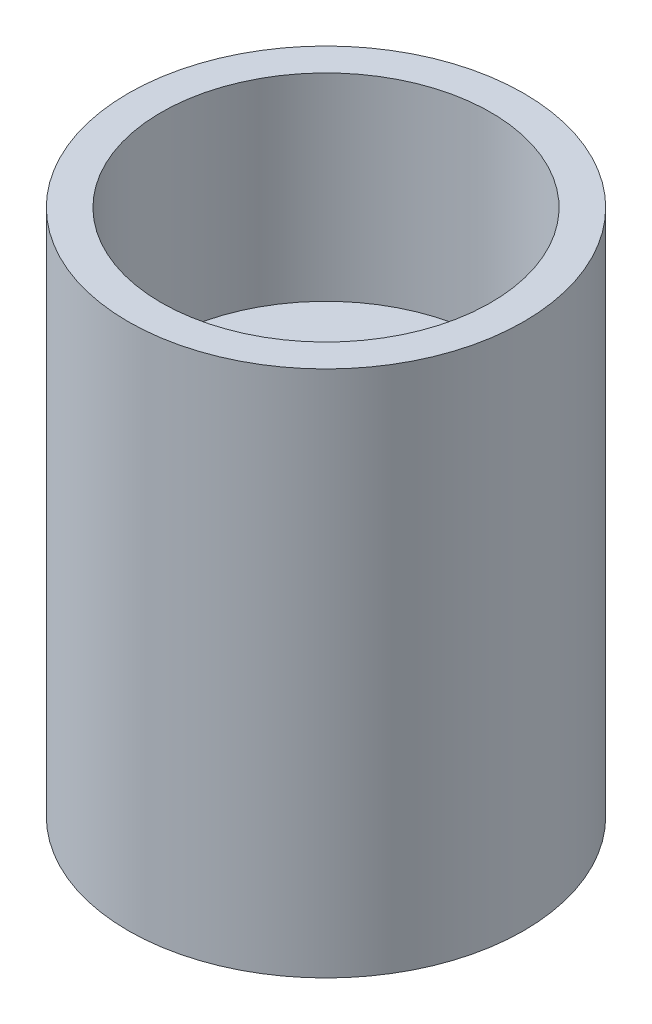
ISO-10303-21;
HEADER;
FILE_DESCRIPTION(('STEP AP214'),'2;1');
FILE_NAME('part.step','',(''),(''),'','','');
FILE_SCHEMA(('AUTOMOTIVE_DESIGN { 1 0 10303 214 1 1 1 1 }'));
ENDSEC;
DATA;
#1=APPLICATION_CONTEXT('core data for automotive mechanical design processes');
#2=APPLICATION_PROTOCOL_DEFINITION('international standard','automotive_design',2000,#1);
#3=PRODUCT_CONTEXT('',#1,'mechanical');
#4=PRODUCT('Part','Part','',(#3));
#5=PRODUCT_RELATED_PRODUCT_CATEGORY('part','',(#4));
#6=PRODUCT_DEFINITION_FORMATION('','',#4);
#7=PRODUCT_DEFINITION_CONTEXT('part definition',#1,'design');
#8=PRODUCT_DEFINITION('design','',#6,#7);
#9=PRODUCT_DEFINITION_SHAPE('','',#8);
#10=(LENGTH_UNIT() NAMED_UNIT(*) SI_UNIT(.MILLI.,.METRE.));
#11=(NAMED_UNIT(*) PLANE_ANGLE_UNIT() SI_UNIT($,.RADIAN.));
#12=(NAMED_UNIT(*) SI_UNIT($,.STERADIAN.) SOLID_ANGLE_UNIT());
#13=UNCERTAINTY_MEASURE_WITH_UNIT(LENGTH_MEASURE(1.E-05),#10,'distance_accuracy_value','');
#14=(GEOMETRIC_REPRESENTATION_CONTEXT(3) GLOBAL_UNCERTAINTY_ASSIGNED_CONTEXT((#13)) GLOBAL_UNIT_ASSIGNED_CONTEXT((#10,
#11,#12)) REPRESENTATION_CONTEXT('',''));
#15=CARTESIAN_POINT('',(0.,0.,0.));
#16=DIRECTION('',(0.,0.,1.));
#17=DIRECTION('',(1.,0.,0.));
#18=AXIS2_PLACEMENT_3D('',#15,#16,#17);
#19=CARTESIAN_POINT('',(0.,8.,0.));
#20=DIRECTION('',(0.,-1.,0.));
#21=DIRECTION('',(0.,0.,-1.));
#22=AXIS2_PLACEMENT_3D('',#19,#20,#21);
#23=CYLINDRICAL_SURFACE('',#22,3.);
#24=CARTESIAN_POINT('',(0.,8.,0.));
#25=DIRECTION('',(0.,1.,0.));
#26=DIRECTION('',(0.,0.,1.));
#27=AXIS2_PLACEMENT_3D('',#24,#25,#26);
#28=CIRCLE('',#27,3.);
#29=CARTESIAN_POINT('',(0.,8.,3.));
#30=VERTEX_POINT('',#29);
#31=EDGE_CURVE('E10',#30,#30,#28,.T.);
#32=ORIENTED_EDGE('',*,*,#31,.F.);
#33=EDGE_LOOP('',(#32));
#34=FACE_BOUND('',#33,.T.);
#35=CARTESIAN_POINT('',(0.,0.,0.));
#36=DIRECTION('',(0.,1.,0.));
#37=DIRECTION('',(0.,0.,1.));
#38=AXIS2_PLACEMENT_3D('',#35,#36,#37);
#39=CIRCLE('',#38,3.);
#40=CARTESIAN_POINT('',(0.,0.,3.));
#41=VERTEX_POINT('',#40);
#42=EDGE_CURVE('E42',#41,#41,#39,.T.);
#43=ORIENTED_EDGE('',*,*,#42,.T.);
#44=EDGE_LOOP('',(#43));
#45=FACE_BOUND('',#44,.T.);
#46=ADVANCED_FACE('F39',(#34,#45),#23,.T.);
#47=CARTESIAN_POINT('',(0.,8.,0.));
#48=DIRECTION('',(0.,1.,0.));
#49=DIRECTION('',(0.,0.,1.));
#50=AXIS2_PLACEMENT_3D('',#47,#48,#49);
#51=PLANE('',#50);
#52=CARTESIAN_POINT('',(0.,8.,0.));
#53=DIRECTION('',(0.,1.,0.));
#54=DIRECTION('',(0.,0.,1.));
#55=AXIS2_PLACEMENT_3D('',#52,#53,#54);
#56=CIRCLE('',#55,2.5);
#57=CARTESIAN_POINT('',(0.,8.,2.5));
#58=VERTEX_POINT('',#57);
#59=EDGE_CURVE('E53',#58,#58,#56,.T.);
#60=ORIENTED_EDGE('',*,*,#59,.F.);
#61=EDGE_LOOP('',(#60));
#62=FACE_BOUND('',#61,.T.);
#63=ORIENTED_EDGE('',*,*,#31,.T.);
#64=EDGE_LOOP('',(#63));
#65=FACE_BOUND('',#64,.T.);
#66=ADVANCED_FACE('F82',(#62,#65),#51,.T.);
#67=CARTESIAN_POINT('',(0.,0.,0.));
#68=DIRECTION('',(0.,1.,0.));
#69=DIRECTION('',(0.,0.,1.));
#70=AXIS2_PLACEMENT_3D('',#67,#68,#69);
#71=PLANE('',#70);
#72=CARTESIAN_POINT('',(0.,0.,0.));
#73=DIRECTION('',(0.,-1.,0.));
#74=DIRECTION('',(0.,0.,-1.));
#75=AXIS2_PLACEMENT_3D('',#72,#73,#74);
#76=CIRCLE('',#75,2.5);
#77=CARTESIAN_POINT('',(0.,0.,-2.5));
#78=VERTEX_POINT('',#77);
#79=EDGE_CURVE('E61',#78,#78,#76,.T.);
#80=ORIENTED_EDGE('',*,*,#79,.F.);
#81=EDGE_LOOP('',(#80));
#82=FACE_BOUND('',#81,.T.);
#83=ORIENTED_EDGE('',*,*,#42,.F.);
#84=EDGE_LOOP('',(#83));
#85=FACE_BOUND('',#84,.T.);
#86=ADVANCED_FACE('F78',(#82,#85),#71,.F.);
#87=CARTESIAN_POINT('',(0.,5.,0.));
#88=DIRECTION('',(0.,1.,0.));
#89=DIRECTION('',(0.,0.,1.));
#90=AXIS2_PLACEMENT_3D('',#87,#88,#89);
#91=CYLINDRICAL_SURFACE('',#90,2.5);
#92=CARTESIAN_POINT('',(0.,5.,0.));
#93=DIRECTION('',(0.,1.,0.));
#94=DIRECTION('',(0.,0.,1.));
#95=AXIS2_PLACEMENT_3D('',#92,#93,#94);
#96=CIRCLE('',#95,2.5);
#97=CARTESIAN_POINT('',(0.,5.,2.5));
#98=VERTEX_POINT('',#97);
#99=EDGE_CURVE('E51',#98,#98,#96,.T.);
#100=ORIENTED_EDGE('',*,*,#99,.F.);
#101=EDGE_LOOP('',(#100));
#102=FACE_BOUND('',#101,.T.);
#103=ORIENTED_EDGE('',*,*,#59,.T.);
#104=EDGE_LOOP('',(#103));
#105=FACE_BOUND('',#104,.T.);
#106=ADVANCED_FACE('F81',(#102,#105),#91,.F.);
#107=CARTESIAN_POINT('',(0.,5.,0.));
#108=DIRECTION('',(0.,1.,0.));
#109=DIRECTION('',(0.,0.,1.));
#110=AXIS2_PLACEMENT_3D('',#107,#108,#109);
#111=PLANE('',#110);
#112=ORIENTED_EDGE('',*,*,#99,.T.);
#113=EDGE_LOOP('',(#112));
#114=FACE_BOUND('',#113,.T.);
#115=ADVANCED_FACE('F74',(#114),#111,.T.);
#116=CARTESIAN_POINT('',(0.,3.,0.));
#117=DIRECTION('',(0.,-1.,0.));
#118=DIRECTION('',(0.,0.,-1.));
#119=AXIS2_PLACEMENT_3D('',#116,#117,#118);
#120=CYLINDRICAL_SURFACE('',#119,2.5);
#121=CARTESIAN_POINT('',(0.,3.,0.));
#122=DIRECTION('',(0.,-1.,0.));
#123=DIRECTION('',(0.,0.,-1.));
#124=AXIS2_PLACEMENT_3D('',#121,#122,#123);
#125=CIRCLE('',#124,2.5);
#126=CARTESIAN_POINT('',(0.,3.,-2.5));
#127=VERTEX_POINT('',#126);
#128=EDGE_CURVE('E57',#127,#127,#125,.T.);
#129=ORIENTED_EDGE('',*,*,#128,.F.);
#130=EDGE_LOOP('',(#129));
#131=FACE_BOUND('',#130,.T.);
#132=ORIENTED_EDGE('',*,*,#79,.T.);
#133=EDGE_LOOP('',(#132));
#134=FACE_BOUND('',#133,.T.);
#135=ADVANCED_FACE('F71',(#131,#134),#120,.F.);
#136=CARTESIAN_POINT('',(0.,3.,0.));
#137=DIRECTION('',(0.,-1.,0.));
#138=DIRECTION('',(0.,0.,-1.));
#139=AXIS2_PLACEMENT_3D('',#136,#137,#138);
#140=PLANE('',#139);
#141=ORIENTED_EDGE('',*,*,#128,.T.);
#142=EDGE_LOOP('',(#141));
#143=FACE_BOUND('',#142,.T.);
#144=ADVANCED_FACE('F69',(#143),#140,.T.);
#145=CLOSED_SHELL('',(#46,#66,#86,#106,#115,#135,#144));
#146=MANIFOLD_SOLID_BREP('B2',#145);
#147=ADVANCED_BREP_SHAPE_REPRESENTATION('',(#18,#146),#14);
#148=SHAPE_DEFINITION_REPRESENTATION(#9,#147);
ENDSEC;
END-ISO-10303-21;
